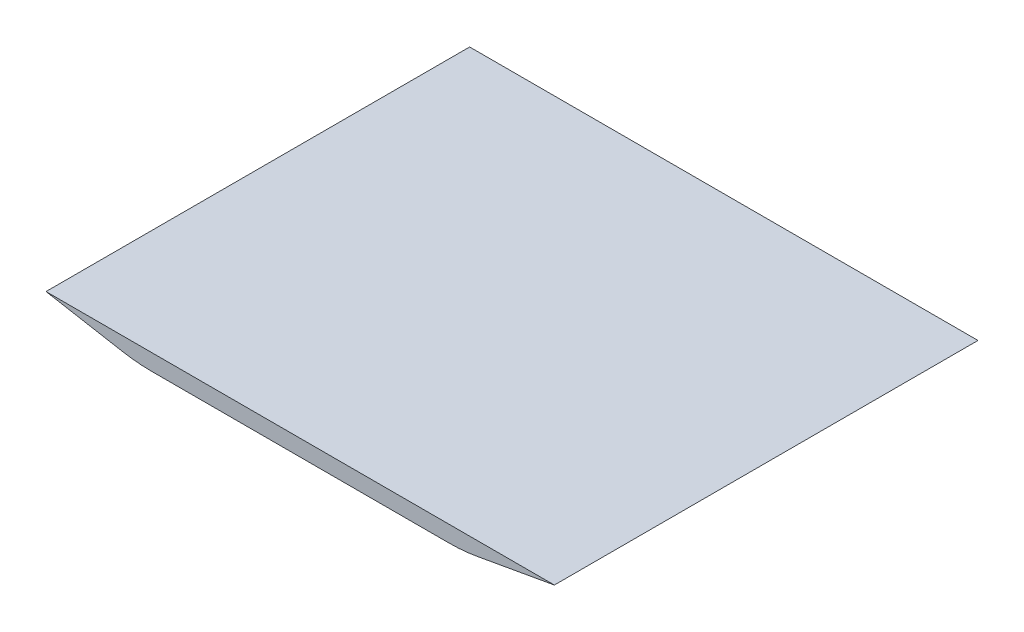
ISO-10303-21;
HEADER;
FILE_DESCRIPTION(('STEP AP214'),'2;1');
FILE_NAME('part.step','',(''),(''),'','','');
FILE_SCHEMA(('AUTOMOTIVE_DESIGN { 1 0 10303 214 1 1 1 1 }'));
ENDSEC;
DATA;
#1=APPLICATION_CONTEXT('core data for automotive mechanical design processes');
#2=APPLICATION_PROTOCOL_DEFINITION('international standard','automotive_design',2000,#1);
#3=PRODUCT_CONTEXT('',#1,'mechanical');
#4=PRODUCT('Part','Part','',(#3));
#5=PRODUCT_RELATED_PRODUCT_CATEGORY('part','',(#4));
#6=PRODUCT_DEFINITION_FORMATION('','',#4);
#7=PRODUCT_DEFINITION_CONTEXT('part definition',#1,'design');
#8=PRODUCT_DEFINITION('design','',#6,#7);
#9=PRODUCT_DEFINITION_SHAPE('','',#8);
#10=(LENGTH_UNIT() NAMED_UNIT(*) SI_UNIT(.MILLI.,.METRE.));
#11=(NAMED_UNIT(*) PLANE_ANGLE_UNIT() SI_UNIT($,.RADIAN.));
#12=(NAMED_UNIT(*) SI_UNIT($,.STERADIAN.) SOLID_ANGLE_UNIT());
#13=UNCERTAINTY_MEASURE_WITH_UNIT(LENGTH_MEASURE(1.E-05),#10,'distance_accuracy_value','');
#14=(GEOMETRIC_REPRESENTATION_CONTEXT(3) GLOBAL_UNCERTAINTY_ASSIGNED_CONTEXT((#13)) GLOBAL_UNIT_ASSIGNED_CONTEXT((#10,
#11,#12)) REPRESENTATION_CONTEXT('',''));
#15=CARTESIAN_POINT('',(0.,0.,0.));
#16=DIRECTION('',(0.,0.,1.));
#17=DIRECTION('',(1.,0.,0.));
#18=AXIS2_PLACEMENT_3D('',#15,#16,#17);
#19=CARTESIAN_POINT('',(28.,-5.00000000000001,130.));
#20=DIRECTION('',(0.175790638483658,0.984427575508482,0.));
#21=DIRECTION('',(-0.984427575508482,0.175790638483658,0.));
#22=AXIS2_PLACEMENT_3D('',#19,#20,#21);
#23=PLANE('',#22);
#24=DIRECTION('',(0.984427575508482,-0.175790638483658,0.));
#25=VECTOR('',#24,1.);
#26=CARTESIAN_POINT('',(28.,-5.00000000000001,0.));
#27=LINE('',#26,#25);
#28=CARTESIAN_POINT('',(0.,0.,0.));
#29=VERTEX_POINT('',#28);
#30=CARTESIAN_POINT('',(23.639721142375,-4.22137877542411,0.));
#31=VERTEX_POINT('',#30);
#32=EDGE_CURVE('E118',#29,#31,#27,.T.);
#33=ORIENTED_EDGE('',*,*,#32,.T.);
#34=DIRECTION('',(0.,0.,-1.));
#35=VECTOR('',#34,1.);
#36=CARTESIAN_POINT('',(23.639721142375,-4.22137877542411,130.));
#37=LINE('',#36,#35);
#38=CARTESIAN_POINT('',(23.639721142375,-4.22137877542411,130.));
#39=VERTEX_POINT('',#38);
#40=EDGE_CURVE('E62',#31,#39,#37,.F.);
#41=ORIENTED_EDGE('',*,*,#40,.T.);
#42=DIRECTION('',(0.984427575508482,-0.175790638483658,0.));
#43=VECTOR('',#42,1.);
#44=CARTESIAN_POINT('',(28.,-5.00000000000001,130.));
#45=LINE('',#44,#43);
#46=CARTESIAN_POINT('',(0.,0.,130.));
#47=VERTEX_POINT('',#46);
#48=EDGE_CURVE('E125',#47,#39,#45,.T.);
#49=ORIENTED_EDGE('',*,*,#48,.F.);
#50=DIRECTION('',(0.,0.,-1.));
#51=VECTOR('',#50,1.);
#52=CARTESIAN_POINT('',(0.,0.,130.));
#53=LINE('',#52,#51);
#54=EDGE_CURVE('E110',#47,#29,#53,.T.);
#55=ORIENTED_EDGE('',*,*,#54,.T.);
#56=EDGE_LOOP('',(#33,#41,#49,#55));
#57=FACE_BOUND('',#56,.T.);
#58=ADVANCED_FACE('F39',(#57),#23,.F.);
#59=CARTESIAN_POINT('',(128.,-5.,130.));
#60=DIRECTION('',(0.,1.,0.));
#61=DIRECTION('',(-1.,0.,0.));
#62=AXIS2_PLACEMENT_3D('',#59,#60,#61);
#63=PLANE('',#62);
#64=DIRECTION('',(1.,0.,0.));
#65=VECTOR('',#64,1.);
#66=CARTESIAN_POINT('',(128.,-5.,130.));
#67=LINE('',#66,#65);
#68=CARTESIAN_POINT('',(32.4292530665579,-5.00000000000001,130.));
#69=VERTEX_POINT('',#68);
#70=CARTESIAN_POINT('',(123.570746933442,-5.,130.));
#71=VERTEX_POINT('',#70);
#72=EDGE_CURVE('E100',#69,#71,#67,.T.);
#73=ORIENTED_EDGE('',*,*,#72,.F.);
#74=DIRECTION('',(0.,0.,-1.));
#75=VECTOR('',#74,1.);
#76=CARTESIAN_POINT('',(32.4292530665579,-5.00000000000001,130.));
#77=LINE('',#76,#75);
#78=CARTESIAN_POINT('',(32.4292530665579,-5.00000000000001,0.));
#79=VERTEX_POINT('',#78);
#80=EDGE_CURVE('E128',#69,#79,#77,.T.);
#81=ORIENTED_EDGE('',*,*,#80,.T.);
#82=DIRECTION('',(1.,0.,0.));
#83=VECTOR('',#82,1.);
#84=CARTESIAN_POINT('',(128.,-5.,0.));
#85=LINE('',#84,#83);
#86=CARTESIAN_POINT('',(123.570746933442,-5.,0.));
#87=VERTEX_POINT('',#86);
#88=EDGE_CURVE('E120',#79,#87,#85,.T.);
#89=ORIENTED_EDGE('',*,*,#88,.T.);
#90=DIRECTION('',(0.,0.,-1.));
#91=VECTOR('',#90,1.);
#92=CARTESIAN_POINT('',(123.570746933442,-5.,130.));
#93=LINE('',#92,#91);
#94=EDGE_CURVE('E109',#87,#71,#93,.F.);
#95=ORIENTED_EDGE('',*,*,#94,.T.);
#96=EDGE_LOOP('',(#73,#81,#89,#95));
#97=FACE_BOUND('',#96,.T.);
#98=ADVANCED_FACE('F141',(#97),#63,.F.);
#99=CARTESIAN_POINT('',(156.,0.,130.));
#100=DIRECTION('',(-0.175790638483658,0.984427575508482,0.));
#101=DIRECTION('',(-0.984427575508482,-0.175790638483658,0.));
#102=AXIS2_PLACEMENT_3D('',#99,#100,#101);
#103=PLANE('',#102);
#104=DIRECTION('',(0.984427575508482,0.175790638483658,0.));
#105=VECTOR('',#104,1.);
#106=CARTESIAN_POINT('',(156.,0.,130.));
#107=LINE('',#106,#105);
#108=CARTESIAN_POINT('',(132.360278857625,-4.2213787754241,130.));
#109=VERTEX_POINT('',#108);
#110=CARTESIAN_POINT('',(156.,0.,130.));
#111=VERTEX_POINT('',#110);
#112=EDGE_CURVE('E92',#109,#111,#107,.T.);
#113=ORIENTED_EDGE('',*,*,#112,.F.);
#114=DIRECTION('',(0.,0.,-1.));
#115=VECTOR('',#114,1.);
#116=CARTESIAN_POINT('',(132.360278857625,-4.22137877542409,130.));
#117=LINE('',#116,#115);
#118=CARTESIAN_POINT('',(132.360278857625,-4.2213787754241,0.));
#119=VERTEX_POINT('',#118);
#120=EDGE_CURVE('E11',#109,#119,#117,.T.);
#121=ORIENTED_EDGE('',*,*,#120,.T.);
#122=DIRECTION('',(0.984427575508482,0.175790638483658,0.));
#123=VECTOR('',#122,1.);
#124=CARTESIAN_POINT('',(156.,0.,0.));
#125=LINE('',#124,#123);
#126=CARTESIAN_POINT('',(156.,0.,0.));
#127=VERTEX_POINT('',#126);
#128=EDGE_CURVE('E106',#119,#127,#125,.T.);
#129=ORIENTED_EDGE('',*,*,#128,.T.);
#130=DIRECTION('',(0.,0.,-1.));
#131=VECTOR('',#130,1.);
#132=CARTESIAN_POINT('',(156.,0.,130.));
#133=LINE('',#132,#131);
#134=EDGE_CURVE('E103',#111,#127,#133,.T.);
#135=ORIENTED_EDGE('',*,*,#134,.F.);
#136=EDGE_LOOP('',(#113,#121,#129,#135));
#137=FACE_BOUND('',#136,.T.);
#138=ADVANCED_FACE('F104',(#137),#103,.F.);
#139=CARTESIAN_POINT('',(0.,0.,130.));
#140=DIRECTION('',(0.,-1.,0.));
#141=DIRECTION('',(0.,0.,-1.));
#142=AXIS2_PLACEMENT_3D('',#139,#140,#141);
#143=PLANE('',#142);
#144=DIRECTION('',(-1.,0.,0.));
#145=VECTOR('',#144,1.);
#146=CARTESIAN_POINT('',(0.,0.,0.));
#147=LINE('',#146,#145);
#148=EDGE_CURVE('E124',#127,#29,#147,.T.);
#149=ORIENTED_EDGE('',*,*,#148,.T.);
#150=ORIENTED_EDGE('',*,*,#54,.F.);
#151=DIRECTION('',(-1.,0.,0.));
#152=VECTOR('',#151,1.);
#153=CARTESIAN_POINT('',(0.,0.,130.));
#154=LINE('',#153,#152);
#155=EDGE_CURVE('E96',#111,#47,#154,.T.);
#156=ORIENTED_EDGE('',*,*,#155,.F.);
#157=ORIENTED_EDGE('',*,*,#134,.T.);
#158=EDGE_LOOP('',(#149,#150,#156,#157));
#159=FACE_BOUND('',#158,.T.);
#160=ADVANCED_FACE('F112',(#159),#143,.F.);
#161=CARTESIAN_POINT('',(0.,0.,130.));
#162=DIRECTION('',(0.,0.,1.));
#163=DIRECTION('',(1.,0.,0.));
#164=AXIS2_PLACEMENT_3D('',#161,#162,#163);
#165=PLANE('',#164);
#166=ORIENTED_EDGE('',*,*,#48,.T.);
#167=CARTESIAN_POINT('',(32.4292530665579,45.,130.));
#168=DIRECTION('',(0.,0.,1.));
#169=DIRECTION('',(1.,0.,0.));
#170=AXIS2_PLACEMENT_3D('',#167,#168,#169);
#171=CIRCLE('',#170,50.);
#172=EDGE_CURVE('E47',#39,#69,#171,.T.);
#173=ORIENTED_EDGE('',*,*,#172,.T.);
#174=ORIENTED_EDGE('',*,*,#72,.T.);
#175=CARTESIAN_POINT('',(123.570746933442,45.,130.));
#176=DIRECTION('',(0.,0.,1.));
#177=DIRECTION('',(1.,0.,0.));
#178=AXIS2_PLACEMENT_3D('',#175,#176,#177);
#179=CIRCLE('',#178,50.);
#180=EDGE_CURVE('E54',#71,#109,#179,.T.);
#181=ORIENTED_EDGE('',*,*,#180,.T.);
#182=ORIENTED_EDGE('',*,*,#112,.T.);
#183=ORIENTED_EDGE('',*,*,#155,.T.);
#184=EDGE_LOOP('',(#166,#173,#174,#181,#182,#183));
#185=FACE_BOUND('',#184,.T.);
#186=ADVANCED_FACE('F94',(#185),#165,.T.);
#187=CARTESIAN_POINT('',(0.,0.,0.));
#188=DIRECTION('',(0.,0.,1.));
#189=DIRECTION('',(1.,0.,0.));
#190=AXIS2_PLACEMENT_3D('',#187,#188,#189);
#191=PLANE('',#190);
#192=ORIENTED_EDGE('',*,*,#88,.F.);
#193=CARTESIAN_POINT('',(32.4292530665579,45.,0.));
#194=DIRECTION('',(0.,0.,1.));
#195=DIRECTION('',(1.,0.,0.));
#196=AXIS2_PLACEMENT_3D('',#193,#194,#195);
#197=CIRCLE('',#196,50.);
#198=EDGE_CURVE('E133',#79,#31,#197,.F.);
#199=ORIENTED_EDGE('',*,*,#198,.T.);
#200=ORIENTED_EDGE('',*,*,#32,.F.);
#201=ORIENTED_EDGE('',*,*,#148,.F.);
#202=ORIENTED_EDGE('',*,*,#128,.F.);
#203=CARTESIAN_POINT('',(123.570746933442,45.,0.));
#204=DIRECTION('',(0.,0.,1.));
#205=DIRECTION('',(1.,0.,0.));
#206=AXIS2_PLACEMENT_3D('',#203,#204,#205);
#207=CIRCLE('',#206,50.);
#208=EDGE_CURVE('E131',#119,#87,#207,.F.);
#209=ORIENTED_EDGE('',*,*,#208,.T.);
#210=EDGE_LOOP('',(#192,#199,#200,#201,#202,#209));
#211=FACE_BOUND('',#210,.T.);
#212=ADVANCED_FACE('F147',(#211),#191,.F.);
#213=CARTESIAN_POINT('',(32.4292530665579,45.,130.));
#214=DIRECTION('',(0.,0.,-1.));
#215=DIRECTION('',(-1.,0.,0.));
#216=AXIS2_PLACEMENT_3D('',#213,#214,#215);
#217=CYLINDRICAL_SURFACE('',#216,50.);
#218=ORIENTED_EDGE('',*,*,#172,.F.);
#219=ORIENTED_EDGE('',*,*,#40,.F.);
#220=ORIENTED_EDGE('',*,*,#198,.F.);
#221=ORIENTED_EDGE('',*,*,#80,.F.);
#222=EDGE_LOOP('',(#218,#219,#220,#221));
#223=FACE_BOUND('',#222,.T.);
#224=ADVANCED_FACE('F144',(#223),#217,.T.);
#225=CARTESIAN_POINT('',(123.570746933442,45.,130.));
#226=DIRECTION('',(0.,0.,-1.));
#227=DIRECTION('',(-1.,0.,0.));
#228=AXIS2_PLACEMENT_3D('',#225,#226,#227);
#229=CYLINDRICAL_SURFACE('',#228,50.);
#230=ORIENTED_EDGE('',*,*,#180,.F.);
#231=ORIENTED_EDGE('',*,*,#94,.F.);
#232=ORIENTED_EDGE('',*,*,#208,.F.);
#233=ORIENTED_EDGE('',*,*,#120,.F.);
#234=EDGE_LOOP('',(#230,#231,#232,#233));
#235=FACE_BOUND('',#234,.T.);
#236=ADVANCED_FACE('F41',(#235),#229,.T.);
#237=CLOSED_SHELL('',(#58,#98,#138,#160,#186,#212,#224,#236));
#238=MANIFOLD_SOLID_BREP('B2',#237);
#239=ADVANCED_BREP_SHAPE_REPRESENTATION('',(#18,#238),#14);
#240=SHAPE_DEFINITION_REPRESENTATION(#9,#239);
ENDSEC;
END-ISO-10303-21;
